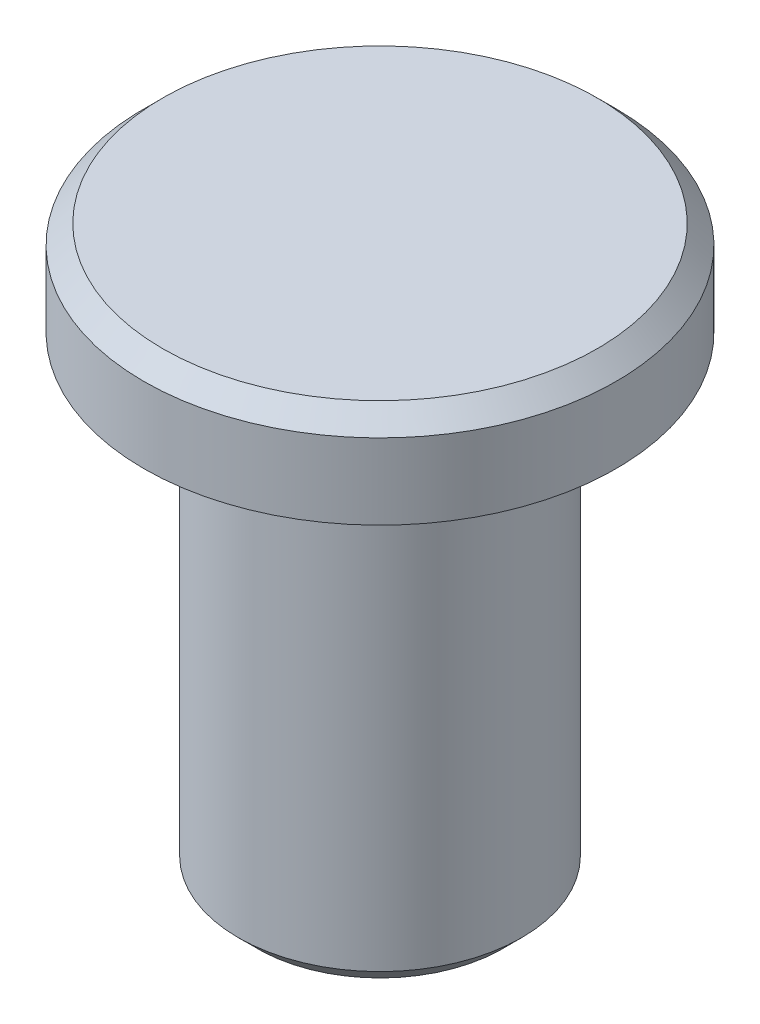
ISO-10303-21;
HEADER;
FILE_DESCRIPTION(('STEP AP214'),'2;1');
FILE_NAME('part.step','',(''),(''),'','','');
FILE_SCHEMA(('AUTOMOTIVE_DESIGN { 1 0 10303 214 1 1 1 1 }'));
ENDSEC;
DATA;
#1=APPLICATION_CONTEXT('core data for automotive mechanical design processes');
#2=APPLICATION_PROTOCOL_DEFINITION('international standard','automotive_design',2000,#1);
#3=PRODUCT_CONTEXT('',#1,'mechanical');
#4=PRODUCT('Part','Part','',(#3));
#5=PRODUCT_RELATED_PRODUCT_CATEGORY('part','',(#4));
#6=PRODUCT_DEFINITION_FORMATION('','',#4);
#7=PRODUCT_DEFINITION_CONTEXT('part definition',#1,'design');
#8=PRODUCT_DEFINITION('design','',#6,#7);
#9=PRODUCT_DEFINITION_SHAPE('','',#8);
#10=(LENGTH_UNIT() NAMED_UNIT(*) SI_UNIT(.MILLI.,.METRE.));
#11=(NAMED_UNIT(*) PLANE_ANGLE_UNIT() SI_UNIT($,.RADIAN.));
#12=(NAMED_UNIT(*) SI_UNIT($,.STERADIAN.) SOLID_ANGLE_UNIT());
#13=UNCERTAINTY_MEASURE_WITH_UNIT(LENGTH_MEASURE(1.E-05),#10,'distance_accuracy_value','');
#14=(GEOMETRIC_REPRESENTATION_CONTEXT(3) GLOBAL_UNCERTAINTY_ASSIGNED_CONTEXT((#13)) GLOBAL_UNIT_ASSIGNED_CONTEXT((#10,
#11,#12)) REPRESENTATION_CONTEXT('',''));
#15=CARTESIAN_POINT('',(0.,0.,0.));
#16=DIRECTION('',(0.,0.,1.));
#17=DIRECTION('',(1.,0.,0.));
#18=AXIS2_PLACEMENT_3D('',#15,#16,#17);
#19=CARTESIAN_POINT('',(1.5,0.,0.));
#20=DIRECTION('',(0.,-1.,0.));
#21=DIRECTION('',(0.,0.,-1.));
#22=AXIS2_PLACEMENT_3D('',#19,#20,#21);
#23=PLANE('',#22);
#24=CARTESIAN_POINT('',(0.,0.,0.));
#25=DIRECTION('',(0.,-1.,0.));
#26=DIRECTION('',(0.,0.,-1.));
#27=AXIS2_PLACEMENT_3D('',#24,#25,#26);
#28=CIRCLE('',#27,1.3);
#29=CARTESIAN_POINT('',(0.,0.,-1.3));
#30=VERTEX_POINT('',#29);
#31=EDGE_CURVE('E49',#30,#30,#28,.T.);
#32=ORIENTED_EDGE('',*,*,#31,.T.);
#33=EDGE_LOOP('',(#32));
#34=FACE_BOUND('',#33,.T.);
#35=ADVANCED_FACE('F33',(#34),#23,.T.);
#36=CARTESIAN_POINT('',(0.,6.,0.));
#37=DIRECTION('',(0.,1.,0.));
#38=DIRECTION('',(0.,0.,1.));
#39=AXIS2_PLACEMENT_3D('',#36,#37,#38);
#40=PLANE('',#39);
#41=CARTESIAN_POINT('',(0.,6.,0.));
#42=DIRECTION('',(0.,1.,0.));
#43=DIRECTION('',(0.,0.,1.));
#44=AXIS2_PLACEMENT_3D('',#41,#42,#43);
#45=CIRCLE('',#44,2.3);
#46=CARTESIAN_POINT('',(0.,6.,2.3));
#47=VERTEX_POINT('',#46);
#48=EDGE_CURVE('E10',#47,#47,#45,.T.);
#49=ORIENTED_EDGE('',*,*,#48,.T.);
#50=EDGE_LOOP('',(#49));
#51=FACE_BOUND('',#50,.T.);
#52=ADVANCED_FACE('F75',(#51),#40,.T.);
#53=CARTESIAN_POINT('',(0.,0.,0.));
#54=DIRECTION('',(0.,-1.,0.));
#55=DIRECTION('',(0.,0.,-1.));
#56=AXIS2_PLACEMENT_3D('',#53,#54,#55);
#57=CYLINDRICAL_SURFACE('',#56,2.5);
#58=CARTESIAN_POINT('',(0.,5.8,0.));
#59=DIRECTION('',(0.,1.,0.));
#60=DIRECTION('',(0.,0.,1.));
#61=AXIS2_PLACEMENT_3D('',#58,#59,#60);
#62=CIRCLE('',#61,2.5);
#63=CARTESIAN_POINT('',(0.,5.8,2.5));
#64=VERTEX_POINT('',#63);
#65=EDGE_CURVE('E41',#64,#64,#62,.F.);
#66=ORIENTED_EDGE('',*,*,#65,.T.);
#67=EDGE_LOOP('',(#66));
#68=FACE_BOUND('',#67,.T.);
#69=CARTESIAN_POINT('',(0.,5.,0.));
#70=DIRECTION('',(0.,-1.,0.));
#71=DIRECTION('',(0.,0.,-1.));
#72=AXIS2_PLACEMENT_3D('',#69,#70,#71);
#73=CIRCLE('',#72,2.5);
#74=CARTESIAN_POINT('',(0.,5.,-2.5));
#75=VERTEX_POINT('',#74);
#76=EDGE_CURVE('E54',#75,#75,#73,.T.);
#77=ORIENTED_EDGE('',*,*,#76,.F.);
#78=EDGE_LOOP('',(#77));
#79=FACE_BOUND('',#78,.T.);
#80=ADVANCED_FACE('F65',(#68,#79),#57,.T.);
#81=CARTESIAN_POINT('',(2.5,5.,0.));
#82=DIRECTION('',(0.,-1.,0.));
#83=DIRECTION('',(0.,0.,-1.));
#84=AXIS2_PLACEMENT_3D('',#81,#82,#83);
#85=PLANE('',#84);
#86=ORIENTED_EDGE('',*,*,#76,.T.);
#87=EDGE_LOOP('',(#86));
#88=FACE_BOUND('',#87,.T.);
#89=CARTESIAN_POINT('',(0.,5.,0.));
#90=DIRECTION('',(0.,-1.,0.));
#91=DIRECTION('',(0.,0.,-1.));
#92=AXIS2_PLACEMENT_3D('',#89,#90,#91);
#93=CIRCLE('',#92,1.5);
#94=CARTESIAN_POINT('',(0.,5.,-1.5));
#95=VERTEX_POINT('',#94);
#96=EDGE_CURVE('E57',#95,#95,#93,.T.);
#97=ORIENTED_EDGE('',*,*,#96,.F.);
#98=EDGE_LOOP('',(#97));
#99=FACE_BOUND('',#98,.T.);
#100=ADVANCED_FACE('F63',(#88,#99),#85,.T.);
#101=CARTESIAN_POINT('',(0.,0.,0.));
#102=DIRECTION('',(0.,-1.,0.));
#103=DIRECTION('',(0.,0.,-1.));
#104=AXIS2_PLACEMENT_3D('',#101,#102,#103);
#105=CYLINDRICAL_SURFACE('',#104,1.5);
#106=CARTESIAN_POINT('',(0.,0.199999999999998,0.));
#107=DIRECTION('',(0.,-1.,0.));
#108=DIRECTION('',(0.,0.,-1.));
#109=AXIS2_PLACEMENT_3D('',#106,#107,#108);
#110=CIRCLE('',#109,1.5);
#111=CARTESIAN_POINT('',(0.,0.199999999999998,-1.5));
#112=VERTEX_POINT('',#111);
#113=EDGE_CURVE('E45',#112,#112,#110,.F.);
#114=ORIENTED_EDGE('',*,*,#113,.T.);
#115=EDGE_LOOP('',(#114));
#116=FACE_BOUND('',#115,.T.);
#117=ORIENTED_EDGE('',*,*,#96,.T.);
#118=EDGE_LOOP('',(#117));
#119=FACE_BOUND('',#118,.T.);
#120=ADVANCED_FACE('F61',(#116,#119),#105,.T.);
#121=CARTESIAN_POINT('',(0.,0.,0.));
#122=DIRECTION('',(0.,1.,0.));
#123=DIRECTION('',(0.,0.,1.));
#124=AXIS2_PLACEMENT_3D('',#121,#122,#123);
#125=CONICAL_SURFACE('',#124,1.3,0.785398163397445);
#126=ORIENTED_EDGE('',*,*,#113,.F.);
#127=EDGE_LOOP('',(#126));
#128=FACE_BOUND('',#127,.T.);
#129=ORIENTED_EDGE('',*,*,#31,.F.);
#130=EDGE_LOOP('',(#129));
#131=FACE_BOUND('',#130,.T.);
#132=ADVANCED_FACE('F72',(#128,#131),#125,.T.);
#133=CARTESIAN_POINT('',(0.,5.8,0.));
#134=DIRECTION('',(0.,-1.,0.));
#135=DIRECTION('',(0.,0.,-1.));
#136=AXIS2_PLACEMENT_3D('',#133,#134,#135);
#137=CONICAL_SURFACE('',#136,2.5,0.78539816339745);
#138=ORIENTED_EDGE('',*,*,#48,.F.);
#139=EDGE_LOOP('',(#138));
#140=FACE_BOUND('',#139,.T.);
#141=ORIENTED_EDGE('',*,*,#65,.F.);
#142=EDGE_LOOP('',(#141));
#143=FACE_BOUND('',#142,.T.);
#144=ADVANCED_FACE('F36',(#140,#143),#137,.T.);
#145=CLOSED_SHELL('',(#35,#52,#80,#100,#120,#132,#144));
#146=MANIFOLD_SOLID_BREP('B2',#145);
#147=ADVANCED_BREP_SHAPE_REPRESENTATION('',(#18,#146),#14);
#148=SHAPE_DEFINITION_REPRESENTATION(#9,#147);
ENDSEC;
END-ISO-10303-21;
